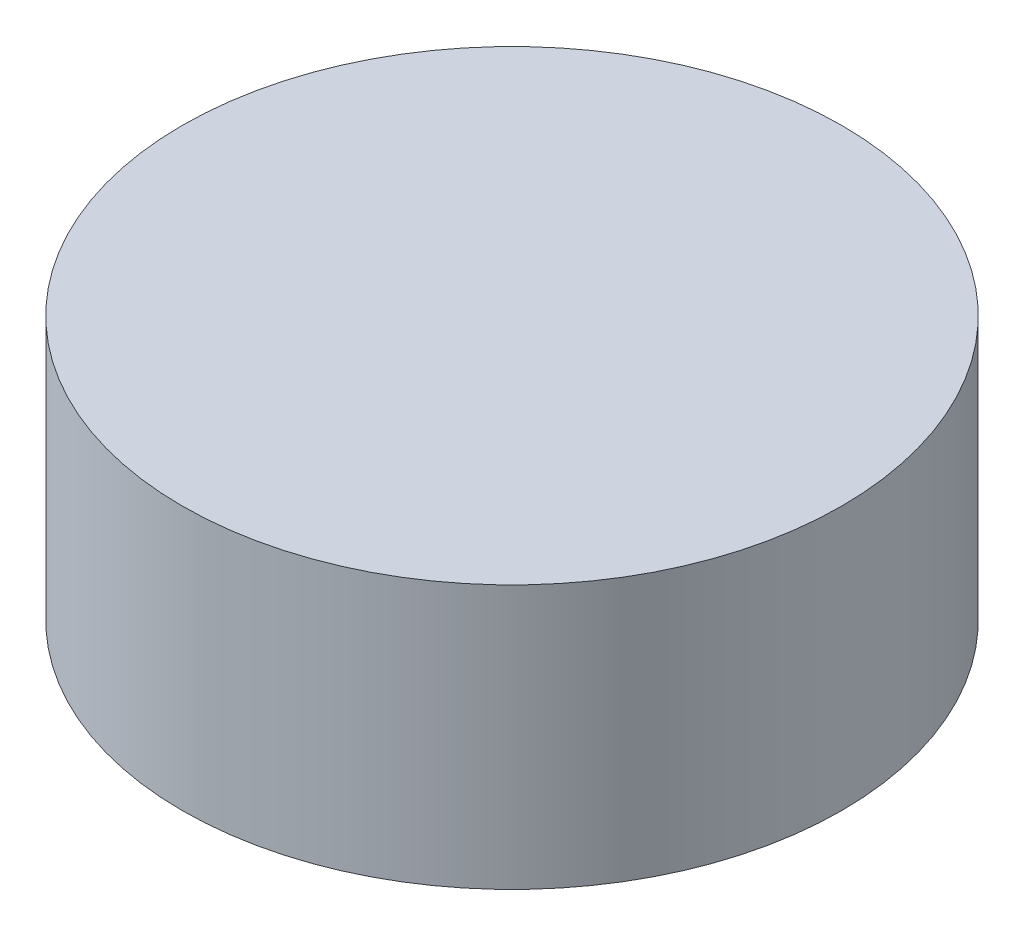
ISO-10303-21;
HEADER;
FILE_DESCRIPTION(('STEP AP214'),'2;1');
FILE_NAME('part.step','',(''),(''),'','','');
FILE_SCHEMA(('AUTOMOTIVE_DESIGN { 1 0 10303 214 1 1 1 1 }'));
ENDSEC;
DATA;
#1=APPLICATION_CONTEXT('core data for automotive mechanical design processes');
#2=APPLICATION_PROTOCOL_DEFINITION('international standard','automotive_design',2000,#1);
#3=PRODUCT_CONTEXT('',#1,'mechanical');
#4=PRODUCT('Part','Part','',(#3));
#5=PRODUCT_RELATED_PRODUCT_CATEGORY('part','',(#4));
#6=PRODUCT_DEFINITION_FORMATION('','',#4);
#7=PRODUCT_DEFINITION_CONTEXT('part definition',#1,'design');
#8=PRODUCT_DEFINITION('design','',#6,#7);
#9=PRODUCT_DEFINITION_SHAPE('','',#8);
#10=(LENGTH_UNIT() NAMED_UNIT(*) SI_UNIT(.MILLI.,.METRE.));
#11=(NAMED_UNIT(*) PLANE_ANGLE_UNIT() SI_UNIT($,.RADIAN.));
#12=(NAMED_UNIT(*) SI_UNIT($,.STERADIAN.) SOLID_ANGLE_UNIT());
#13=UNCERTAINTY_MEASURE_WITH_UNIT(LENGTH_MEASURE(1.E-05),#10,'distance_accuracy_value','');
#14=(GEOMETRIC_REPRESENTATION_CONTEXT(3) GLOBAL_UNCERTAINTY_ASSIGNED_CONTEXT((#13)) GLOBAL_UNIT_ASSIGNED_CONTEXT((#10,
#11,#12)) REPRESENTATION_CONTEXT('',''));
#15=CARTESIAN_POINT('',(0.,0.,0.));
#16=DIRECTION('',(0.,0.,1.));
#17=DIRECTION('',(1.,0.,0.));
#18=AXIS2_PLACEMENT_3D('',#15,#16,#17);
#19=CARTESIAN_POINT('',(0.,20.,0.));
#20=DIRECTION('',(0.,-1.,0.));
#21=DIRECTION('',(0.,0.,-1.));
#22=AXIS2_PLACEMENT_3D('',#19,#20,#21);
#23=CYLINDRICAL_SURFACE('',#22,25.);
#24=CARTESIAN_POINT('',(0.,20.,0.));
#25=DIRECTION('',(0.,1.,0.));
#26=DIRECTION('',(0.,0.,1.));
#27=AXIS2_PLACEMENT_3D('',#24,#25,#26);
#28=CIRCLE('',#27,25.);
#29=CARTESIAN_POINT('',(0.,20.,25.));
#30=VERTEX_POINT('',#29);
#31=EDGE_CURVE('E10',#30,#30,#28,.T.);
#32=ORIENTED_EDGE('',*,*,#31,.F.);
#33=EDGE_LOOP('',(#32));
#34=FACE_BOUND('',#33,.T.);
#35=CARTESIAN_POINT('',(0.,0.,0.));
#36=DIRECTION('',(0.,1.,0.));
#37=DIRECTION('',(0.,0.,1.));
#38=AXIS2_PLACEMENT_3D('',#35,#36,#37);
#39=CIRCLE('',#38,25.);
#40=CARTESIAN_POINT('',(0.,0.,25.));
#41=VERTEX_POINT('',#40);
#42=EDGE_CURVE('E34',#41,#41,#39,.T.);
#43=ORIENTED_EDGE('',*,*,#42,.T.);
#44=EDGE_LOOP('',(#43));
#45=FACE_BOUND('',#44,.T.);
#46=ADVANCED_FACE('F31',(#34,#45),#23,.T.);
#47=CARTESIAN_POINT('',(0.,20.,0.));
#48=DIRECTION('',(0.,1.,0.));
#49=DIRECTION('',(0.,0.,1.));
#50=AXIS2_PLACEMENT_3D('',#47,#48,#49);
#51=PLANE('',#50);
#52=ORIENTED_EDGE('',*,*,#31,.T.);
#53=EDGE_LOOP('',(#52));
#54=FACE_BOUND('',#53,.T.);
#55=ADVANCED_FACE('F46',(#54),#51,.T.);
#56=CARTESIAN_POINT('',(0.,0.,0.));
#57=DIRECTION('',(0.,1.,0.));
#58=DIRECTION('',(0.,0.,1.));
#59=AXIS2_PLACEMENT_3D('',#56,#57,#58);
#60=PLANE('',#59);
#61=ORIENTED_EDGE('',*,*,#42,.F.);
#62=EDGE_LOOP('',(#61));
#63=FACE_BOUND('',#62,.T.);
#64=ADVANCED_FACE('F44',(#63),#60,.F.);
#65=CLOSED_SHELL('',(#46,#55,#64));
#66=MANIFOLD_SOLID_BREP('B2',#65);
#67=ADVANCED_BREP_SHAPE_REPRESENTATION('',(#18,#66),#14);
#68=SHAPE_DEFINITION_REPRESENTATION(#9,#67);
ENDSEC;
END-ISO-10303-21;
